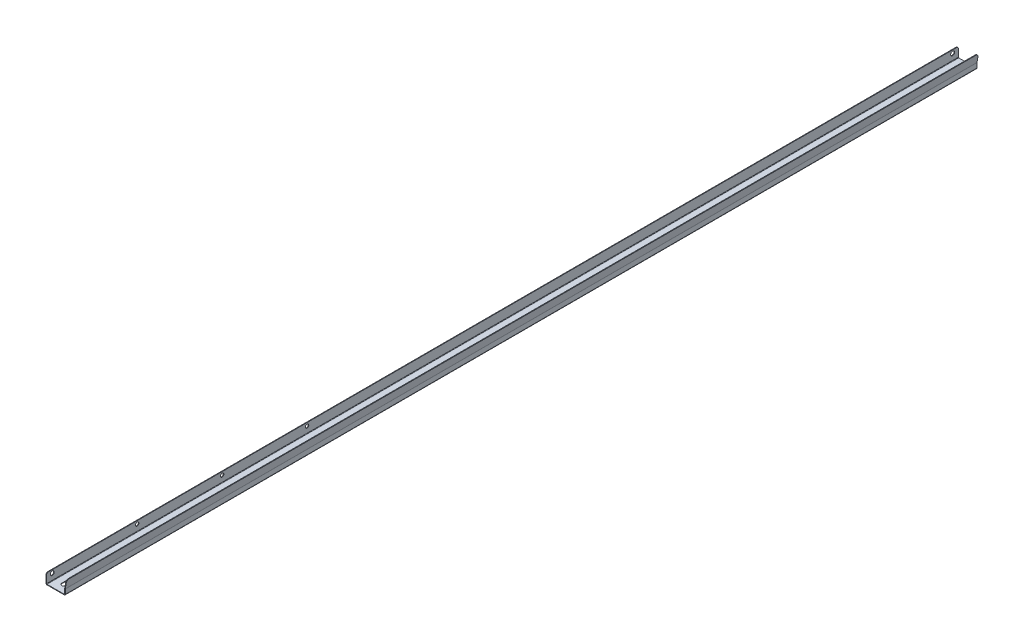
ISO-10303-21;
HEADER;
FILE_DESCRIPTION(('STEP AP214'),'2;1');
FILE_NAME('part.step','',(''),(''),'','','');
FILE_SCHEMA(('AUTOMOTIVE_DESIGN { 1 0 10303 214 1 1 1 1 }'));
ENDSEC;
DATA;
#1=APPLICATION_CONTEXT('core data for automotive mechanical design processes');
#2=APPLICATION_PROTOCOL_DEFINITION('international standard','automotive_design',2000,#1);
#3=PRODUCT_CONTEXT('',#1,'mechanical');
#4=PRODUCT('Part','Part','',(#3));
#5=PRODUCT_RELATED_PRODUCT_CATEGORY('part','',(#4));
#6=PRODUCT_DEFINITION_FORMATION('','',#4);
#7=PRODUCT_DEFINITION_CONTEXT('part definition',#1,'design');
#8=PRODUCT_DEFINITION('design','',#6,#7);
#9=PRODUCT_DEFINITION_SHAPE('','',#8);
#10=(LENGTH_UNIT() NAMED_UNIT(*) SI_UNIT(.MILLI.,.METRE.));
#11=(NAMED_UNIT(*) PLANE_ANGLE_UNIT() SI_UNIT($,.RADIAN.));
#12=(NAMED_UNIT(*) SI_UNIT($,.STERADIAN.) SOLID_ANGLE_UNIT());
#13=UNCERTAINTY_MEASURE_WITH_UNIT(LENGTH_MEASURE(1.E-05),#10,'distance_accuracy_value','');
#14=(GEOMETRIC_REPRESENTATION_CONTEXT(3) GLOBAL_UNCERTAINTY_ASSIGNED_CONTEXT((#13)) GLOBAL_UNIT_ASSIGNED_CONTEXT((#10,
#11,#12)) REPRESENTATION_CONTEXT('',''));
#15=CARTESIAN_POINT('',(0.,0.,0.));
#16=DIRECTION('',(0.,0.,1.));
#17=DIRECTION('',(1.,0.,0.));
#18=AXIS2_PLACEMENT_3D('',#15,#16,#17);
#19=CARTESIAN_POINT('',(3.99999999999992,9.,740.));
#20=DIRECTION('',(1.,0.,0.));
#21=DIRECTION('',(0.,0.,1.));
#22=AXIS2_PLACEMENT_3D('',#19,#20,#21);
#23=PLANE('',#22);
#24=DIRECTION('',(0.,0.,-1.));
#25=VECTOR('',#24,1.);
#26=CARTESIAN_POINT('',(4.00000000000006,0.,0.));
#27=LINE('',#26,#25);
#28=CARTESIAN_POINT('',(3.99999999999991,0.,790.));
#29=VERTEX_POINT('',#28);
#30=CARTESIAN_POINT('',(3.99999999999992,0.,740.));
#31=VERTEX_POINT('',#30);
#32=EDGE_CURVE('E413',#29,#31,#27,.T.);
#33=ORIENTED_EDGE('',*,*,#32,.T.);
#34=DIRECTION('',(0.,-1.,0.));
#35=VECTOR('',#34,1.);
#36=CARTESIAN_POINT('',(3.99999999999992,9.,740.));
#37=LINE('',#36,#35);
#38=CARTESIAN_POINT('',(3.99999999999992,-1.,740.));
#39=VERTEX_POINT('',#38);
#40=EDGE_CURVE('E594',#31,#39,#37,.T.);
#41=ORIENTED_EDGE('',*,*,#40,.T.);
#42=DIRECTION('',(0.,0.,1.));
#43=VECTOR('',#42,1.);
#44=CARTESIAN_POINT('',(3.99999999999992,-1.,740.));
#45=LINE('',#44,#43);
#46=CARTESIAN_POINT('',(4.,-1.,790.));
#47=VERTEX_POINT('',#46);
#48=EDGE_CURVE('E326',#39,#47,#45,.T.);
#49=ORIENTED_EDGE('',*,*,#48,.T.);
#50=DIRECTION('',(0.,-1.,0.));
#51=VECTOR('',#50,1.);
#52=CARTESIAN_POINT('',(4.,9.,790.));
#53=LINE('',#52,#51);
#54=EDGE_CURVE('E11',#29,#47,#53,.T.);
#55=ORIENTED_EDGE('',*,*,#54,.F.);
#56=EDGE_LOOP('',(#33,#41,#49,#55));
#57=FACE_BOUND('',#56,.T.);
#58=ADVANCED_FACE('F17',(#57),#23,.F.);
#59=CARTESIAN_POINT('',(0.,9.,790.));
#60=DIRECTION('',(0.,-1.,0.));
#61=DIRECTION('',(0.,0.,-1.));
#62=AXIS2_PLACEMENT_3D('',#59,#60,#61);
#63=CYLINDRICAL_SURFACE('',#62,4.);
#64=CARTESIAN_POINT('',(0.,0.,790.));
#65=DIRECTION('',(0.,1.,0.));
#66=DIRECTION('',(0.,0.,1.));
#67=AXIS2_PLACEMENT_3D('',#64,#65,#66);
#68=CIRCLE('',#67,4.);
#69=CARTESIAN_POINT('',(-4.00000000000009,0.,790.));
#70=VERTEX_POINT('',#69);
#71=EDGE_CURVE('E420',#70,#29,#68,.T.);
#72=ORIENTED_EDGE('',*,*,#71,.T.);
#73=ORIENTED_EDGE('',*,*,#54,.T.);
#74=CARTESIAN_POINT('',(0.,-1.,790.));
#75=DIRECTION('',(0.,-1.,0.));
#76=DIRECTION('',(0.,0.,-1.));
#77=AXIS2_PLACEMENT_3D('',#74,#75,#76);
#78=CIRCLE('',#77,4.);
#79=CARTESIAN_POINT('',(-4.00000000000009,-1.,790.));
#80=VERTEX_POINT('',#79);
#81=EDGE_CURVE('E361',#47,#80,#78,.T.);
#82=ORIENTED_EDGE('',*,*,#81,.T.);
#83=DIRECTION('',(0.,-1.,0.));
#84=VECTOR('',#83,1.);
#85=CARTESIAN_POINT('',(-4.00000000000009,9.,790.));
#86=LINE('',#85,#84);
#87=EDGE_CURVE('E21',#70,#80,#86,.T.);
#88=ORIENTED_EDGE('',*,*,#87,.F.);
#89=EDGE_LOOP('',(#72,#73,#82,#88));
#90=FACE_BOUND('',#89,.T.);
#91=ADVANCED_FACE('F19',(#90),#63,.F.);
#92=CARTESIAN_POINT('',(-4.00000000000008,9.,740.));
#93=DIRECTION('',(-1.,0.,0.));
#94=DIRECTION('',(0.,0.,1.));
#95=AXIS2_PLACEMENT_3D('',#92,#93,#94);
#96=PLANE('',#95);
#97=DIRECTION('',(0.,0.,1.));
#98=VECTOR('',#97,1.);
#99=CARTESIAN_POINT('',(-3.99999999999994,0.,0.));
#100=LINE('',#99,#98);
#101=CARTESIAN_POINT('',(-4.00000000000008,0.,740.));
#102=VERTEX_POINT('',#101);
#103=EDGE_CURVE('E424',#102,#70,#100,.T.);
#104=ORIENTED_EDGE('',*,*,#103,.T.);
#105=ORIENTED_EDGE('',*,*,#87,.T.);
#106=DIRECTION('',(0.,0.,-1.));
#107=VECTOR('',#106,1.);
#108=CARTESIAN_POINT('',(-4.00000000000008,-1.,740.));
#109=LINE('',#108,#107);
#110=CARTESIAN_POINT('',(-4.00000000000008,-1.,740.));
#111=VERTEX_POINT('',#110);
#112=EDGE_CURVE('E380',#80,#111,#109,.T.);
#113=ORIENTED_EDGE('',*,*,#112,.T.);
#114=DIRECTION('',(0.,-1.,0.));
#115=VECTOR('',#114,1.);
#116=CARTESIAN_POINT('',(-4.00000000000008,9.,740.));
#117=LINE('',#116,#115);
#118=EDGE_CURVE('E391',#102,#111,#117,.T.);
#119=ORIENTED_EDGE('',*,*,#118,.F.);
#120=EDGE_LOOP('',(#104,#105,#113,#119));
#121=FACE_BOUND('',#120,.T.);
#122=ADVANCED_FACE('F605',(#121),#96,.F.);
#123=CARTESIAN_POINT('',(0.,9.,740.));
#124=DIRECTION('',(0.,-1.,0.));
#125=DIRECTION('',(0.,0.,-1.));
#126=AXIS2_PLACEMENT_3D('',#123,#124,#125);
#127=CYLINDRICAL_SURFACE('',#126,4.);
#128=CARTESIAN_POINT('',(0.,0.,740.));
#129=DIRECTION('',(0.,1.,0.));
#130=DIRECTION('',(0.,0.,1.));
#131=AXIS2_PLACEMENT_3D('',#128,#129,#130);
#132=CIRCLE('',#131,4.);
#133=EDGE_CURVE('E404',#31,#102,#132,.T.);
#134=ORIENTED_EDGE('',*,*,#133,.T.);
#135=ORIENTED_EDGE('',*,*,#118,.T.);
#136=CARTESIAN_POINT('',(0.,-1.,740.));
#137=DIRECTION('',(0.,-1.,0.));
#138=DIRECTION('',(0.,0.,-1.));
#139=AXIS2_PLACEMENT_3D('',#136,#137,#138);
#140=CIRCLE('',#139,4.);
#141=EDGE_CURVE('E376',#111,#39,#140,.T.);
#142=ORIENTED_EDGE('',*,*,#141,.T.);
#143=ORIENTED_EDGE('',*,*,#40,.F.);
#144=EDGE_LOOP('',(#134,#135,#142,#143));
#145=FACE_BOUND('',#144,.T.);
#146=ADVANCED_FACE('F774',(#145),#127,.F.);
#147=CARTESIAN_POINT('',(17.7364817766693,18.935566193648,-800.));
#148=DIRECTION('',(0.984807753012209,-0.173648177666927,0.));
#149=DIRECTION('',(0.173648177666927,0.984807753012209,0.));
#150=AXIS2_PLACEMENT_3D('',#147,#148,#149);
#151=CYLINDRICAL_SURFACE('',#150,5.);
#152=CARTESIAN_POINT('',(17.7364817766693,18.935566193648,-800.));
#153=DIRECTION('',(-0.984807753012209,0.173648177666927,0.));
#154=DIRECTION('',(0.173648177666927,0.984807753012209,0.));
#155=AXIS2_PLACEMENT_3D('',#152,#153,#154);
#156=CIRCLE('',#155,5.);
#157=CARTESIAN_POINT('',(18.6047226650039,23.8596049587091,-800.));
#158=VERTEX_POINT('',#157);
#159=CARTESIAN_POINT('',(17.7364817766693,18.935566193648,-805.));
#160=VERTEX_POINT('',#159);
#161=EDGE_CURVE('E346',#158,#160,#156,.T.);
#162=ORIENTED_EDGE('',*,*,#161,.F.);
#163=DIRECTION('',(-0.984807753012209,0.173648177666927,0.));
#164=VECTOR('',#163,1.);
#165=CARTESIAN_POINT('',(18.6047226650039,23.8596049587091,-800.));
#166=LINE('',#165,#164);
#167=CARTESIAN_POINT('',(19.5895304180161,23.6859567810421,-800.));
#168=VERTEX_POINT('',#167);
#169=EDGE_CURVE('E40',#168,#158,#166,.T.);
#170=ORIENTED_EDGE('',*,*,#169,.F.);
#171=CARTESIAN_POINT('',(18.7212895296815,18.7619180159811,-800.));
#172=DIRECTION('',(0.984807753012209,-0.173648177666927,0.));
#173=DIRECTION('',(0.173648177666927,0.984807753012209,0.));
#174=AXIS2_PLACEMENT_3D('',#171,#172,#173);
#175=CIRCLE('',#174,5.);
#176=CARTESIAN_POINT('',(18.7212895296815,18.7619180159811,-805.));
#177=VERTEX_POINT('',#176);
#178=EDGE_CURVE('E229',#177,#168,#175,.T.);
#179=ORIENTED_EDGE('',*,*,#178,.F.);
#180=DIRECTION('',(0.984807753012209,-0.173648177666927,0.));
#181=VECTOR('',#180,1.);
#182=CARTESIAN_POINT('',(17.7364817766693,18.935566193648,-805.));
#183=LINE('',#182,#181);
#184=EDGE_CURVE('E408',#160,#177,#183,.T.);
#185=ORIENTED_EDGE('',*,*,#184,.F.);
#186=EDGE_LOOP('',(#162,#170,#179,#185));
#187=FACE_BOUND('',#186,.T.);
#188=ADVANCED_FACE('F770',(#187),#151,.T.);
#189=CARTESIAN_POINT('',(17.7364817766693,18.935566193648,800.));
#190=DIRECTION('',(0.984807753012209,-0.173648177666927,0.));
#191=DIRECTION('',(0.173648177666927,0.984807753012209,0.));
#192=AXIS2_PLACEMENT_3D('',#189,#190,#191);
#193=CYLINDRICAL_SURFACE('',#192,5.);
#194=CARTESIAN_POINT('',(17.7364817766693,18.935566193648,800.));
#195=DIRECTION('',(-0.984807753012209,0.173648177666927,0.));
#196=DIRECTION('',(0.173648177666927,0.984807753012209,0.));
#197=AXIS2_PLACEMENT_3D('',#194,#195,#196);
#198=CIRCLE('',#197,5.);
#199=CARTESIAN_POINT('',(17.7364817766693,18.9355661936481,805.));
#200=VERTEX_POINT('',#199);
#201=CARTESIAN_POINT('',(18.6047226650039,23.8596049587091,800.));
#202=VERTEX_POINT('',#201);
#203=EDGE_CURVE('E517',#200,#202,#198,.T.);
#204=ORIENTED_EDGE('',*,*,#203,.F.);
#205=DIRECTION('',(-0.984807753012209,0.173648177666927,0.));
#206=VECTOR('',#205,1.);
#207=CARTESIAN_POINT('',(17.7364817766693,18.9355661936481,805.));
#208=LINE('',#207,#206);
#209=CARTESIAN_POINT('',(18.7212895296815,18.7619180159811,805.));
#210=VERTEX_POINT('',#209);
#211=EDGE_CURVE('E548',#210,#200,#208,.T.);
#212=ORIENTED_EDGE('',*,*,#211,.F.);
#213=CARTESIAN_POINT('',(18.7212895296815,18.7619180159811,800.));
#214=DIRECTION('',(0.984807753012209,-0.173648177666927,0.));
#215=DIRECTION('',(0.173648177666927,0.984807753012209,0.));
#216=AXIS2_PLACEMENT_3D('',#213,#214,#215);
#217=CIRCLE('',#216,5.);
#218=CARTESIAN_POINT('',(19.5895304180161,23.6859567810421,800.));
#219=VERTEX_POINT('',#218);
#220=EDGE_CURVE('E345',#219,#210,#217,.T.);
#221=ORIENTED_EDGE('',*,*,#220,.F.);
#222=DIRECTION('',(0.984807753012209,-0.173648177666927,0.));
#223=VECTOR('',#222,1.);
#224=CARTESIAN_POINT('',(18.6047226650039,23.8596049587091,800.));
#225=LINE('',#224,#223);
#226=EDGE_CURVE('E54',#202,#219,#225,.T.);
#227=ORIENTED_EDGE('',*,*,#226,.F.);
#228=EDGE_LOOP('',(#204,#212,#221,#227));
#229=FACE_BOUND('',#228,.T.);
#230=ADVANCED_FACE('F773',(#229),#193,.T.);
#231=CARTESIAN_POINT('',(-17.,14.,-802.));
#232=DIRECTION('',(1.,0.,0.));
#233=DIRECTION('',(0.,1.,0.));
#234=AXIS2_PLACEMENT_3D('',#231,#232,#233);
#235=CYLINDRICAL_SURFACE('',#234,3.);
#236=CARTESIAN_POINT('',(-17.,14.,-802.));
#237=DIRECTION('',(-1.,0.,0.));
#238=DIRECTION('',(0.,1.,0.));
#239=AXIS2_PLACEMENT_3D('',#236,#237,#238);
#240=CIRCLE('',#239,3.);
#241=CARTESIAN_POINT('',(-17.,17.,-802.));
#242=VERTEX_POINT('',#241);
#243=CARTESIAN_POINT('',(-17.,14.,-805.));
#244=VERTEX_POINT('',#243);
#245=EDGE_CURVE('E352',#242,#244,#240,.T.);
#246=ORIENTED_EDGE('',*,*,#245,.F.);
#247=DIRECTION('',(-1.,0.,0.));
#248=VECTOR('',#247,1.);
#249=CARTESIAN_POINT('',(-17.,17.,-802.));
#250=LINE('',#249,#248);
#251=CARTESIAN_POINT('',(-16.,17.,-802.));
#252=VERTEX_POINT('',#251);
#253=EDGE_CURVE('E557',#252,#242,#250,.T.);
#254=ORIENTED_EDGE('',*,*,#253,.F.);
#255=CARTESIAN_POINT('',(-16.,14.,-802.));
#256=DIRECTION('',(1.,0.,0.));
#257=DIRECTION('',(0.,1.,0.));
#258=AXIS2_PLACEMENT_3D('',#255,#256,#257);
#259=CIRCLE('',#258,3.);
#260=CARTESIAN_POINT('',(-16.,14.,-805.));
#261=VERTEX_POINT('',#260);
#262=EDGE_CURVE('E533',#261,#252,#259,.T.);
#263=ORIENTED_EDGE('',*,*,#262,.F.);
#264=DIRECTION('',(1.,0.,0.));
#265=VECTOR('',#264,1.);
#266=CARTESIAN_POINT('',(-17.,14.,-805.));
#267=LINE('',#266,#265);
#268=EDGE_CURVE('E500',#244,#261,#267,.T.);
#269=ORIENTED_EDGE('',*,*,#268,.F.);
#270=EDGE_LOOP('',(#246,#254,#263,#269));
#271=FACE_BOUND('',#270,.T.);
#272=ADVANCED_FACE('F673',(#271),#235,.T.);
#273=CARTESIAN_POINT('',(-17.,14.,802.));
#274=DIRECTION('',(1.,0.,0.));
#275=DIRECTION('',(0.,1.,0.));
#276=AXIS2_PLACEMENT_3D('',#273,#274,#275);
#277=CYLINDRICAL_SURFACE('',#276,3.);
#278=CARTESIAN_POINT('',(-17.,14.,802.));
#279=DIRECTION('',(-1.,0.,0.));
#280=DIRECTION('',(0.,1.,0.));
#281=AXIS2_PLACEMENT_3D('',#278,#279,#280);
#282=CIRCLE('',#281,3.);
#283=CARTESIAN_POINT('',(-17.,14.,805.));
#284=VERTEX_POINT('',#283);
#285=CARTESIAN_POINT('',(-17.,17.,802.));
#286=VERTEX_POINT('',#285);
#287=EDGE_CURVE('E428',#284,#286,#282,.T.);
#288=ORIENTED_EDGE('',*,*,#287,.F.);
#289=DIRECTION('',(-1.,0.,0.));
#290=VECTOR('',#289,1.);
#291=CARTESIAN_POINT('',(-17.,14.,805.));
#292=LINE('',#291,#290);
#293=CARTESIAN_POINT('',(-16.,14.,805.));
#294=VERTEX_POINT('',#293);
#295=EDGE_CURVE('E368',#294,#284,#292,.T.);
#296=ORIENTED_EDGE('',*,*,#295,.F.);
#297=CARTESIAN_POINT('',(-16.,14.,802.));
#298=DIRECTION('',(1.,0.,0.));
#299=DIRECTION('',(0.,1.,0.));
#300=AXIS2_PLACEMENT_3D('',#297,#298,#299);
#301=CIRCLE('',#300,3.);
#302=CARTESIAN_POINT('',(-16.,17.,802.));
#303=VERTEX_POINT('',#302);
#304=EDGE_CURVE('E530',#303,#294,#301,.T.);
#305=ORIENTED_EDGE('',*,*,#304,.F.);
#306=DIRECTION('',(1.,0.,0.));
#307=VECTOR('',#306,1.);
#308=CARTESIAN_POINT('',(-17.,17.,802.));
#309=LINE('',#308,#307);
#310=EDGE_CURVE('E551',#286,#303,#309,.T.);
#311=ORIENTED_EDGE('',*,*,#310,.F.);
#312=EDGE_LOOP('',(#288,#296,#305,#311));
#313=FACE_BOUND('',#312,.T.);
#314=ADVANCED_FACE('F664',(#313),#277,.T.);
#315=CARTESIAN_POINT('',(-7.,11.5,-795.));
#316=DIRECTION('',(-1.,0.,0.));
#317=DIRECTION('',(0.,-1.,0.));
#318=AXIS2_PLACEMENT_3D('',#315,#316,#317);
#319=CYLINDRICAL_SURFACE('',#318,3.49999999999996);
#320=CARTESIAN_POINT('',(-16.,11.5,-795.));
#321=DIRECTION('',(1.,0.,0.));
#322=DIRECTION('',(0.,1.,0.));
#323=AXIS2_PLACEMENT_3D('',#320,#321,#322);
#324=CIRCLE('',#323,3.49999999999996);
#325=CARTESIAN_POINT('',(-16.,15.,-795.));
#326=VERTEX_POINT('',#325);
#327=EDGE_CURVE('E537',#326,#326,#324,.T.);
#328=ORIENTED_EDGE('',*,*,#327,.T.);
#329=EDGE_LOOP('',(#328));
#330=FACE_BOUND('',#329,.T.);
#331=CARTESIAN_POINT('',(-17.,11.5,-795.));
#332=DIRECTION('',(-1.,0.,0.));
#333=DIRECTION('',(0.,-1.,0.));
#334=AXIS2_PLACEMENT_3D('',#331,#332,#333);
#335=CIRCLE('',#334,3.49999999999996);
#336=CARTESIAN_POINT('',(-17.,8.,-795.));
#337=VERTEX_POINT('',#336);
#338=EDGE_CURVE('E355',#337,#337,#335,.T.);
#339=ORIENTED_EDGE('',*,*,#338,.T.);
#340=EDGE_LOOP('',(#339));
#341=FACE_BOUND('',#340,.T.);
#342=ADVANCED_FACE('F702',(#330,#341),#319,.F.);
#343=CARTESIAN_POINT('',(-7.,11.5,795.));
#344=DIRECTION('',(-1.,0.,0.));
#345=DIRECTION('',(0.,-1.,0.));
#346=AXIS2_PLACEMENT_3D('',#343,#344,#345);
#347=CYLINDRICAL_SURFACE('',#346,3.49999999999996);
#348=CARTESIAN_POINT('',(-16.,11.5,795.));
#349=DIRECTION('',(1.,0.,0.));
#350=DIRECTION('',(0.,1.,0.));
#351=AXIS2_PLACEMENT_3D('',#348,#349,#350);
#352=CIRCLE('',#351,3.49999999999996);
#353=CARTESIAN_POINT('',(-16.,15.,795.));
#354=VERTEX_POINT('',#353);
#355=EDGE_CURVE('E540',#354,#354,#352,.T.);
#356=ORIENTED_EDGE('',*,*,#355,.T.);
#357=EDGE_LOOP('',(#356));
#358=FACE_BOUND('',#357,.T.);
#359=CARTESIAN_POINT('',(-17.,11.5,795.));
#360=DIRECTION('',(-1.,0.,0.));
#361=DIRECTION('',(0.,-1.,0.));
#362=AXIS2_PLACEMENT_3D('',#359,#360,#361);
#363=CIRCLE('',#362,3.49999999999996);
#364=CARTESIAN_POINT('',(-17.,8.,795.));
#365=VERTEX_POINT('',#364);
#366=EDGE_CURVE('E521',#365,#365,#363,.T.);
#367=ORIENTED_EDGE('',*,*,#366,.T.);
#368=EDGE_LOOP('',(#367));
#369=FACE_BOUND('',#368,.T.);
#370=ADVANCED_FACE('F704',(#358,#369),#347,.F.);
#371=CARTESIAN_POINT('',(-7.,11.5,645.));
#372=DIRECTION('',(-1.,0.,0.));
#373=DIRECTION('',(0.,-1.,0.));
#374=AXIS2_PLACEMENT_3D('',#371,#372,#373);
#375=CYLINDRICAL_SURFACE('',#374,3.00000000000005);
#376=CARTESIAN_POINT('',(-16.,11.5,645.));
#377=DIRECTION('',(1.,0.,0.));
#378=DIRECTION('',(0.,1.,0.));
#379=AXIS2_PLACEMENT_3D('',#376,#377,#378);
#380=CIRCLE('',#379,3.00000000000005);
#381=CARTESIAN_POINT('',(-16.,14.5,645.));
#382=VERTEX_POINT('',#381);
#383=EDGE_CURVE('E385',#382,#382,#380,.T.);
#384=ORIENTED_EDGE('',*,*,#383,.T.);
#385=EDGE_LOOP('',(#384));
#386=FACE_BOUND('',#385,.T.);
#387=CARTESIAN_POINT('',(-17.,11.5,645.));
#388=DIRECTION('',(-1.,0.,0.));
#389=DIRECTION('',(0.,-1.,0.));
#390=AXIS2_PLACEMENT_3D('',#387,#388,#389);
#391=CIRCLE('',#390,3.00000000000005);
#392=CARTESIAN_POINT('',(-17.,8.49999999999986,645.));
#393=VERTEX_POINT('',#392);
#394=EDGE_CURVE('E437',#393,#393,#391,.T.);
#395=ORIENTED_EDGE('',*,*,#394,.T.);
#396=EDGE_LOOP('',(#395));
#397=FACE_BOUND('',#396,.T.);
#398=ADVANCED_FACE('F643',(#386,#397),#375,.F.);
#399=CARTESIAN_POINT('',(-7.,11.5,495.));
#400=DIRECTION('',(-1.,0.,0.));
#401=DIRECTION('',(0.,-1.,0.));
#402=AXIS2_PLACEMENT_3D('',#399,#400,#401);
#403=CYLINDRICAL_SURFACE('',#402,3.00000000000005);
#404=CARTESIAN_POINT('',(-16.,11.5,495.));
#405=DIRECTION('',(1.,0.,0.));
#406=DIRECTION('',(0.,1.,0.));
#407=AXIS2_PLACEMENT_3D('',#404,#405,#406);
#408=CIRCLE('',#407,3.00000000000005);
#409=CARTESIAN_POINT('',(-16.,14.5,495.));
#410=VERTEX_POINT('',#409);
#411=EDGE_CURVE('E381',#410,#410,#408,.T.);
#412=ORIENTED_EDGE('',*,*,#411,.T.);
#413=EDGE_LOOP('',(#412));
#414=FACE_BOUND('',#413,.T.);
#415=CARTESIAN_POINT('',(-17.,11.5,495.));
#416=DIRECTION('',(-1.,0.,0.));
#417=DIRECTION('',(0.,-1.,0.));
#418=AXIS2_PLACEMENT_3D('',#415,#416,#417);
#419=CIRCLE('',#418,3.00000000000005);
#420=CARTESIAN_POINT('',(-17.,8.49999999999983,495.));
#421=VERTEX_POINT('',#420);
#422=EDGE_CURVE('E433',#421,#421,#419,.T.);
#423=ORIENTED_EDGE('',*,*,#422,.T.);
#424=EDGE_LOOP('',(#423));
#425=FACE_BOUND('',#424,.T.);
#426=ADVANCED_FACE('F777',(#414,#425),#403,.F.);
#427=CARTESIAN_POINT('',(-7.,11.5,345.));
#428=DIRECTION('',(-1.,0.,0.));
#429=DIRECTION('',(0.,-1.,0.));
#430=AXIS2_PLACEMENT_3D('',#427,#428,#429);
#431=CYLINDRICAL_SURFACE('',#430,3.);
#432=CARTESIAN_POINT('',(-16.,11.4999999999999,345.));
#433=DIRECTION('',(1.,0.,0.));
#434=DIRECTION('',(0.,1.,0.));
#435=AXIS2_PLACEMENT_3D('',#432,#433,#434);
#436=CIRCLE('',#435,3.);
#437=CARTESIAN_POINT('',(-16.,14.4999999999999,345.));
#438=VERTEX_POINT('',#437);
#439=EDGE_CURVE('E384',#438,#438,#436,.T.);
#440=ORIENTED_EDGE('',*,*,#439,.T.);
#441=EDGE_LOOP('',(#440));
#442=FACE_BOUND('',#441,.T.);
#443=CARTESIAN_POINT('',(-17.,11.4999999999999,345.));
#444=DIRECTION('',(-1.,0.,0.));
#445=DIRECTION('',(0.,-1.,0.));
#446=AXIS2_PLACEMENT_3D('',#443,#444,#445);
#447=CIRCLE('',#446,3.);
#448=CARTESIAN_POINT('',(-17.,8.49999999999987,345.));
#449=VERTEX_POINT('',#448);
#450=EDGE_CURVE('E436',#449,#449,#447,.T.);
#451=ORIENTED_EDGE('',*,*,#450,.T.);
#452=EDGE_LOOP('',(#451));
#453=FACE_BOUND('',#452,.T.);
#454=ADVANCED_FACE('F769',(#442,#453),#431,.F.);
#455=CARTESIAN_POINT('',(18.6047226650039,23.8596049587091,-805.));
#456=DIRECTION('',(-0.173648177666927,-0.984807753012209,0.));
#457=DIRECTION('',(-0.984807753012209,0.173648177666927,0.));
#458=AXIS2_PLACEMENT_3D('',#455,#456,#457);
#459=PLANE('',#458);
#460=DIRECTION('',(0.,0.,-1.));
#461=VECTOR('',#460,1.);
#462=CARTESIAN_POINT('',(18.6047226650039,23.8596049587091,-805.));
#463=LINE('',#462,#461);
#464=EDGE_CURVE('E416',#202,#158,#463,.T.);
#465=ORIENTED_EDGE('',*,*,#464,.F.);
#466=ORIENTED_EDGE('',*,*,#226,.T.);
#467=DIRECTION('',(0.,0.,-1.));
#468=VECTOR('',#467,1.);
#469=CARTESIAN_POINT('',(19.5895304180161,23.6859567810421,-805.));
#470=LINE('',#469,#468);
#471=EDGE_CURVE('E343',#219,#168,#470,.T.);
#472=ORIENTED_EDGE('',*,*,#471,.T.);
#473=ORIENTED_EDGE('',*,*,#169,.T.);
#474=EDGE_LOOP('',(#465,#466,#472,#473));
#475=FACE_BOUND('',#474,.T.);
#476=ADVANCED_FACE('F765',(#475),#459,.F.);
#477=CARTESIAN_POINT('',(14.9482966317148,-2.63578801180474,0.));
#478=DIRECTION('',(0.984807753012209,-0.173648177666927,0.));
#479=DIRECTION('',(0.,0.,-1.));
#480=AXIS2_PLACEMENT_3D('',#477,#478,#479);
#481=PLANE('',#480);
#482=ORIENTED_EDGE('',*,*,#471,.F.);
#483=ORIENTED_EDGE('',*,*,#220,.T.);
#484=DIRECTION('',(0.173648177666927,0.984807753012209,0.));
#485=VECTOR('',#484,1.);
#486=CARTESIAN_POINT('',(19.5895304180161,23.6859567810421,805.));
#487=LINE('',#486,#485);
#488=CARTESIAN_POINT('',(17.0111906091313,9.06346509811626,805.));
#489=VERTEX_POINT('',#488);
#490=EDGE_CURVE('E474',#489,#210,#487,.T.);
#491=ORIENTED_EDGE('',*,*,#490,.F.);
#492=DIRECTION('',(0.,0.,1.));
#493=VECTOR('',#492,1.);
#494=CARTESIAN_POINT('',(17.0111906091313,9.06346509811626,-805.));
#495=LINE('',#494,#493);
#496=CARTESIAN_POINT('',(17.0111906091313,9.06346509811626,-805.));
#497=VERTEX_POINT('',#496);
#498=EDGE_CURVE('E470',#497,#489,#495,.T.);
#499=ORIENTED_EDGE('',*,*,#498,.F.);
#500=DIRECTION('',(-0.173648177666927,-0.984807753012209,0.));
#501=VECTOR('',#500,1.);
#502=CARTESIAN_POINT('',(17.,9.,-805.));
#503=LINE('',#502,#501);
#504=EDGE_CURVE('E580',#177,#497,#503,.T.);
#505=ORIENTED_EDGE('',*,*,#504,.F.);
#506=ORIENTED_EDGE('',*,*,#178,.T.);
#507=EDGE_LOOP('',(#482,#483,#491,#499,#505,#506));
#508=FACE_BOUND('',#507,.T.);
#509=ADVANCED_FACE('F768',(#508),#481,.T.);
#510=CARTESIAN_POINT('',(13.9634888787026,-2.46213983413781,0.));
#511=DIRECTION('',(0.984807753012209,-0.173648177666927,0.));
#512=DIRECTION('',(0.,0.,-1.));
#513=AXIS2_PLACEMENT_3D('',#510,#511,#512);
#514=PLANE('',#513);
#515=DIRECTION('',(0.173648177666927,0.984807753012209,0.));
#516=VECTOR('',#515,1.);
#517=CARTESIAN_POINT('',(18.6047226650039,23.8596049587091,805.));
#518=LINE('',#517,#516);
#519=CARTESIAN_POINT('',(16.026382856119,9.23711327578318,805.));
#520=VERTEX_POINT('',#519);
#521=EDGE_CURVE('E409',#520,#200,#518,.T.);
#522=ORIENTED_EDGE('',*,*,#521,.T.);
#523=ORIENTED_EDGE('',*,*,#203,.T.);
#524=ORIENTED_EDGE('',*,*,#464,.T.);
#525=ORIENTED_EDGE('',*,*,#161,.T.);
#526=DIRECTION('',(-0.173648177666927,-0.984807753012209,0.));
#527=VECTOR('',#526,1.);
#528=CARTESIAN_POINT('',(16.0151922469879,9.17364817766693,-805.));
#529=LINE('',#528,#527);
#530=CARTESIAN_POINT('',(16.026382856119,9.23711327578319,-805.));
#531=VERTEX_POINT('',#530);
#532=EDGE_CURVE('E405',#160,#531,#529,.T.);
#533=ORIENTED_EDGE('',*,*,#532,.T.);
#534=DIRECTION('',(0.,0.,-1.));
#535=VECTOR('',#534,1.);
#536=CARTESIAN_POINT('',(16.026382856119,9.23711327578319,0.));
#537=LINE('',#536,#535);
#538=EDGE_CURVE('E475',#520,#531,#537,.T.);
#539=ORIENTED_EDGE('',*,*,#538,.F.);
#540=EDGE_LOOP('',(#522,#523,#524,#525,#533,#539));
#541=FACE_BOUND('',#540,.T.);
#542=ADVANCED_FACE('F763',(#541),#514,.F.);
#543=CARTESIAN_POINT('',(16.0151922469879,9.17364817766693,-805.));
#544=DIRECTION('',(0.,0.,1.));
#545=DIRECTION('',(1.,0.,0.));
#546=AXIS2_PLACEMENT_3D('',#543,#544,#545);
#547=PLANE('',#546);
#548=ORIENTED_EDGE('',*,*,#532,.F.);
#549=ORIENTED_EDGE('',*,*,#184,.T.);
#550=ORIENTED_EDGE('',*,*,#504,.T.);
#551=DIRECTION('',(-0.984807753012209,0.173648177666927,0.));
#552=VECTOR('',#551,1.);
#553=CARTESIAN_POINT('',(17.0111906091313,9.06346509811626,-805.));
#554=LINE('',#553,#552);
#555=EDGE_CURVE('E284',#497,#531,#554,.T.);
#556=ORIENTED_EDGE('',*,*,#555,.T.);
#557=EDGE_LOOP('',(#548,#549,#550,#556));
#558=FACE_BOUND('',#557,.T.);
#559=ADVANCED_FACE('F759',(#558),#547,.F.);
#560=CARTESIAN_POINT('',(18.6047226650039,23.8596049587091,805.));
#561=DIRECTION('',(0.,0.,-1.));
#562=DIRECTION('',(0.,-1.,0.));
#563=AXIS2_PLACEMENT_3D('',#560,#561,#562);
#564=PLANE('',#563);
#565=ORIENTED_EDGE('',*,*,#490,.T.);
#566=ORIENTED_EDGE('',*,*,#211,.T.);
#567=ORIENTED_EDGE('',*,*,#521,.F.);
#568=DIRECTION('',(-0.984807753012209,0.173648177666927,0.));
#569=VECTOR('',#568,1.);
#570=CARTESIAN_POINT('',(17.0111906091313,9.06346509811625,805.));
#571=LINE('',#570,#569);
#572=EDGE_CURVE('E332',#489,#520,#571,.T.);
#573=ORIENTED_EDGE('',*,*,#572,.F.);
#574=EDGE_LOOP('',(#565,#566,#567,#573));
#575=FACE_BOUND('',#574,.T.);
#576=ADVANCED_FACE('F755',(#575),#564,.F.);
#577=CARTESIAN_POINT('',(17.7366,8.9355558504468,805.));
#578=DIRECTION('',(0.,0.,1.));
#579=DIRECTION('',(-0.984807753012209,0.173648177666928,0.));
#580=AXIS2_PLACEMENT_3D('',#577,#578,#579);
#581=CYLINDRICAL_SURFACE('',#580,0.73660000000001);
#582=DIRECTION('',(0.,0.,-1.));
#583=VECTOR('',#582,1.);
#584=CARTESIAN_POINT('',(17.,8.9355558504468,805.));
#585=LINE('',#584,#583);
#586=CARTESIAN_POINT('',(17.,8.9355558504468,805.));
#587=VERTEX_POINT('',#586);
#588=CARTESIAN_POINT('',(17.,8.9355558504468,-805.));
#589=VERTEX_POINT('',#588);
#590=EDGE_CURVE('E298',#587,#589,#585,.T.);
#591=ORIENTED_EDGE('',*,*,#590,.T.);
#592=CARTESIAN_POINT('',(17.7366,8.9355558504468,-805.));
#593=DIRECTION('',(0.,0.,-1.));
#594=DIRECTION('',(1.,0.,0.));
#595=AXIS2_PLACEMENT_3D('',#592,#593,#594);
#596=CIRCLE('',#595,0.736600000000011);
#597=EDGE_CURVE('E562',#589,#497,#596,.T.);
#598=ORIENTED_EDGE('',*,*,#597,.T.);
#599=ORIENTED_EDGE('',*,*,#498,.T.);
#600=CARTESIAN_POINT('',(17.7366,8.9355558504468,805.));
#601=DIRECTION('',(0.,0.,1.));
#602=DIRECTION('',(1.,0.,0.));
#603=AXIS2_PLACEMENT_3D('',#600,#601,#602);
#604=CIRCLE('',#603,0.736600000000011);
#605=EDGE_CURVE('E328',#489,#587,#604,.T.);
#606=ORIENTED_EDGE('',*,*,#605,.T.);
#607=EDGE_LOOP('',(#591,#598,#599,#606));
#608=FACE_BOUND('',#607,.T.);
#609=ADVANCED_FACE('F751',(#608),#581,.F.);
#610=CARTESIAN_POINT('',(17.7366,8.9355558504468,805.));
#611=DIRECTION('',(0.,0.,1.));
#612=DIRECTION('',(-0.984807753012209,0.173648177666927,0.));
#613=AXIS2_PLACEMENT_3D('',#610,#611,#612);
#614=CYLINDRICAL_SURFACE('',#613,1.7366);
#615=DIRECTION('',(0.,0.,-1.));
#616=VECTOR('',#615,1.);
#617=CARTESIAN_POINT('',(16.,8.93555585044681,805.));
#618=LINE('',#617,#616);
#619=CARTESIAN_POINT('',(16.,8.93555585044681,805.));
#620=VERTEX_POINT('',#619);
#621=CARTESIAN_POINT('',(16.,8.9355558504468,-805.));
#622=VERTEX_POINT('',#621);
#623=EDGE_CURVE('E297',#620,#622,#618,.T.);
#624=ORIENTED_EDGE('',*,*,#623,.F.);
#625=CARTESIAN_POINT('',(17.7366,8.9355558504468,805.));
#626=DIRECTION('',(0.,0.,1.));
#627=DIRECTION('',(1.,0.,0.));
#628=AXIS2_PLACEMENT_3D('',#625,#626,#627);
#629=CIRCLE('',#628,1.7366);
#630=EDGE_CURVE('E510',#520,#620,#629,.T.);
#631=ORIENTED_EDGE('',*,*,#630,.F.);
#632=ORIENTED_EDGE('',*,*,#538,.T.);
#633=CARTESIAN_POINT('',(17.7366,8.9355558504468,-805.));
#634=DIRECTION('',(0.,0.,-1.));
#635=DIRECTION('',(1.,0.,0.));
#636=AXIS2_PLACEMENT_3D('',#633,#634,#635);
#637=CIRCLE('',#636,1.7366);
#638=EDGE_CURVE('E333',#622,#531,#637,.T.);
#639=ORIENTED_EDGE('',*,*,#638,.F.);
#640=EDGE_LOOP('',(#624,#631,#632,#639));
#641=FACE_BOUND('',#640,.T.);
#642=ADVANCED_FACE('F747',(#641),#614,.T.);
#643=CARTESIAN_POINT('',(17.7366,8.9355558504468,805.));
#644=DIRECTION('',(0.,0.,-1.));
#645=DIRECTION('',(0.,-1.,0.));
#646=AXIS2_PLACEMENT_3D('',#643,#644,#645);
#647=PLANE('',#646);
#648=ORIENTED_EDGE('',*,*,#605,.F.);
#649=ORIENTED_EDGE('',*,*,#572,.T.);
#650=ORIENTED_EDGE('',*,*,#630,.T.);
#651=DIRECTION('',(-1.,0.,0.));
#652=VECTOR('',#651,1.);
#653=CARTESIAN_POINT('',(17.,8.9355558504468,805.));
#654=LINE('',#653,#652);
#655=EDGE_CURVE('E621',#587,#620,#654,.T.);
#656=ORIENTED_EDGE('',*,*,#655,.F.);
#657=EDGE_LOOP('',(#648,#649,#650,#656));
#658=FACE_BOUND('',#657,.T.);
#659=ADVANCED_FACE('F743',(#658),#647,.F.);
#660=CARTESIAN_POINT('',(17.7366,8.9355558504468,-805.));
#661=DIRECTION('',(0.,0.,-1.));
#662=DIRECTION('',(0.,-1.,0.));
#663=AXIS2_PLACEMENT_3D('',#660,#661,#662);
#664=PLANE('',#663);
#665=ORIENTED_EDGE('',*,*,#555,.F.);
#666=ORIENTED_EDGE('',*,*,#597,.F.);
#667=DIRECTION('',(-1.,0.,0.));
#668=VECTOR('',#667,1.);
#669=CARTESIAN_POINT('',(17.,8.9355558504468,-805.));
#670=LINE('',#669,#668);
#671=EDGE_CURVE('E310',#589,#622,#670,.T.);
#672=ORIENTED_EDGE('',*,*,#671,.T.);
#673=ORIENTED_EDGE('',*,*,#638,.T.);
#674=EDGE_LOOP('',(#665,#666,#672,#673));
#675=FACE_BOUND('',#674,.T.);
#676=ADVANCED_FACE('F739',(#675),#664,.T.);
#677=CARTESIAN_POINT('',(15.2634,0.7366,-805.));
#678=DIRECTION('',(0.,0.,-1.));
#679=DIRECTION('',(1.,0.,0.));
#680=AXIS2_PLACEMENT_3D('',#677,#678,#679);
#681=CYLINDRICAL_SURFACE('',#680,0.7366);
#682=DIRECTION('',(0.,0.,1.));
#683=VECTOR('',#682,1.);
#684=CARTESIAN_POINT('',(15.2634,0.,-805.));
#685=LINE('',#684,#683);
#686=CARTESIAN_POINT('',(15.2634,0.,-805.));
#687=VERTEX_POINT('',#686);
#688=CARTESIAN_POINT('',(15.2634,0.,805.));
#689=VERTEX_POINT('',#688);
#690=EDGE_CURVE('E320',#687,#689,#685,.T.);
#691=ORIENTED_EDGE('',*,*,#690,.T.);
#692=CARTESIAN_POINT('',(15.2634,0.7366,805.));
#693=DIRECTION('',(0.,0.,1.));
#694=DIRECTION('',(-1.,0.,0.));
#695=AXIS2_PLACEMENT_3D('',#692,#693,#694);
#696=CIRCLE('',#695,0.7366);
#697=CARTESIAN_POINT('',(16.,0.7366,805.));
#698=VERTEX_POINT('',#697);
#699=EDGE_CURVE('E395',#689,#698,#696,.T.);
#700=ORIENTED_EDGE('',*,*,#699,.T.);
#701=DIRECTION('',(0.,0.,-1.));
#702=VECTOR('',#701,1.);
#703=CARTESIAN_POINT('',(16.,0.7366,805.));
#704=LINE('',#703,#702);
#705=CARTESIAN_POINT('',(16.,0.7366,-805.));
#706=VERTEX_POINT('',#705);
#707=EDGE_CURVE('E351',#698,#706,#704,.T.);
#708=ORIENTED_EDGE('',*,*,#707,.T.);
#709=CARTESIAN_POINT('',(15.2634,0.7366,-805.));
#710=DIRECTION('',(0.,0.,-1.));
#711=DIRECTION('',(-1.,0.,0.));
#712=AXIS2_PLACEMENT_3D('',#709,#710,#711);
#713=CIRCLE('',#712,0.7366);
#714=EDGE_CURVE('E264',#706,#687,#713,.T.);
#715=ORIENTED_EDGE('',*,*,#714,.T.);
#716=EDGE_LOOP('',(#691,#700,#708,#715));
#717=FACE_BOUND('',#716,.T.);
#718=ADVANCED_FACE('F736',(#717),#681,.F.);
#719=CARTESIAN_POINT('',(15.2634,0.7366,-805.));
#720=DIRECTION('',(0.,0.,-1.));
#721=DIRECTION('',(1.,0.,0.));
#722=AXIS2_PLACEMENT_3D('',#719,#720,#721);
#723=CYLINDRICAL_SURFACE('',#722,1.7366);
#724=DIRECTION('',(0.,0.,1.));
#725=VECTOR('',#724,1.);
#726=CARTESIAN_POINT('',(15.2634,-1.,-805.));
#727=LINE('',#726,#725);
#728=CARTESIAN_POINT('',(15.2634,-1.,-805.));
#729=VERTEX_POINT('',#728);
#730=CARTESIAN_POINT('',(15.2634,-1.,805.));
#731=VERTEX_POINT('',#730);
#732=EDGE_CURVE('E281',#729,#731,#727,.T.);
#733=ORIENTED_EDGE('',*,*,#732,.F.);
#734=CARTESIAN_POINT('',(15.2634,0.7366,-805.));
#735=DIRECTION('',(0.,0.,-1.));
#736=DIRECTION('',(-1.,0.,0.));
#737=AXIS2_PLACEMENT_3D('',#734,#735,#736);
#738=CIRCLE('',#737,1.7366);
#739=CARTESIAN_POINT('',(17.,0.7366,-805.));
#740=VERTEX_POINT('',#739);
#741=EDGE_CURVE('E275',#740,#729,#738,.T.);
#742=ORIENTED_EDGE('',*,*,#741,.F.);
#743=DIRECTION('',(0.,0.,1.));
#744=VECTOR('',#743,1.);
#745=CARTESIAN_POINT('',(17.,0.7366,0.));
#746=LINE('',#745,#744);
#747=CARTESIAN_POINT('',(17.,0.7366,805.));
#748=VERTEX_POINT('',#747);
#749=EDGE_CURVE('E278',#740,#748,#746,.T.);
#750=ORIENTED_EDGE('',*,*,#749,.T.);
#751=CARTESIAN_POINT('',(15.2634,0.7366,805.));
#752=DIRECTION('',(0.,0.,1.));
#753=DIRECTION('',(-1.,0.,0.));
#754=AXIS2_PLACEMENT_3D('',#751,#752,#753);
#755=CIRCLE('',#754,1.7366);
#756=EDGE_CURVE('E392',#731,#748,#755,.T.);
#757=ORIENTED_EDGE('',*,*,#756,.F.);
#758=EDGE_LOOP('',(#733,#742,#750,#757));
#759=FACE_BOUND('',#758,.T.);
#760=ADVANCED_FACE('F277',(#759),#723,.T.);
#761=CARTESIAN_POINT('',(15.2634,0.7366,-805.));
#762=DIRECTION('',(0.,0.,1.));
#763=DIRECTION('',(1.,0.,0.));
#764=AXIS2_PLACEMENT_3D('',#761,#762,#763);
#765=PLANE('',#764);
#766=ORIENTED_EDGE('',*,*,#714,.F.);
#767=DIRECTION('',(1.,0.,0.));
#768=VECTOR('',#767,1.);
#769=CARTESIAN_POINT('',(16.,0.7366,-805.));
#770=LINE('',#769,#768);
#771=EDGE_CURVE('E301',#706,#740,#770,.T.);
#772=ORIENTED_EDGE('',*,*,#771,.T.);
#773=ORIENTED_EDGE('',*,*,#741,.T.);
#774=DIRECTION('',(0.,-1.,0.));
#775=VECTOR('',#774,1.);
#776=CARTESIAN_POINT('',(15.2634,0.,-805.));
#777=LINE('',#776,#775);
#778=EDGE_CURVE('E432',#687,#729,#777,.T.);
#779=ORIENTED_EDGE('',*,*,#778,.F.);
#780=EDGE_LOOP('',(#766,#772,#773,#779));
#781=FACE_BOUND('',#780,.T.);
#782=ADVANCED_FACE('F302',(#781),#765,.F.);
#783=CARTESIAN_POINT('',(15.2634,0.7366,805.));
#784=DIRECTION('',(0.,0.,1.));
#785=DIRECTION('',(1.,0.,0.));
#786=AXIS2_PLACEMENT_3D('',#783,#784,#785);
#787=PLANE('',#786);
#788=DIRECTION('',(1.,0.,0.));
#789=VECTOR('',#788,1.);
#790=CARTESIAN_POINT('',(16.,0.7366,805.));
#791=LINE('',#790,#789);
#792=EDGE_CURVE('E628',#698,#748,#791,.T.);
#793=ORIENTED_EDGE('',*,*,#792,.F.);
#794=ORIENTED_EDGE('',*,*,#699,.F.);
#795=DIRECTION('',(0.,-1.,0.));
#796=VECTOR('',#795,1.);
#797=CARTESIAN_POINT('',(15.2634,0.,805.));
#798=LINE('',#797,#796);
#799=EDGE_CURVE('E442',#689,#731,#798,.T.);
#800=ORIENTED_EDGE('',*,*,#799,.T.);
#801=ORIENTED_EDGE('',*,*,#756,.T.);
#802=EDGE_LOOP('',(#793,#794,#800,#801));
#803=FACE_BOUND('',#802,.T.);
#804=ADVANCED_FACE('F728',(#803),#787,.T.);
#805=CARTESIAN_POINT('',(-17.,17.,-805.));
#806=DIRECTION('',(0.,-1.,0.));
#807=DIRECTION('',(0.,0.,-1.));
#808=AXIS2_PLACEMENT_3D('',#805,#806,#807);
#809=PLANE('',#808);
#810=DIRECTION('',(0.,0.,-1.));
#811=VECTOR('',#810,1.);
#812=CARTESIAN_POINT('',(-17.,17.,-805.));
#813=LINE('',#812,#811);
#814=EDGE_CURVE('E356',#286,#242,#813,.T.);
#815=ORIENTED_EDGE('',*,*,#814,.F.);
#816=ORIENTED_EDGE('',*,*,#310,.T.);
#817=DIRECTION('',(0.,0.,-1.));
#818=VECTOR('',#817,1.);
#819=CARTESIAN_POINT('',(-16.,17.,-805.));
#820=LINE('',#819,#818);
#821=EDGE_CURVE('E526',#303,#252,#820,.T.);
#822=ORIENTED_EDGE('',*,*,#821,.T.);
#823=ORIENTED_EDGE('',*,*,#253,.T.);
#824=EDGE_LOOP('',(#815,#816,#822,#823));
#825=FACE_BOUND('',#824,.T.);
#826=ADVANCED_FACE('F668',(#825),#809,.F.);
#827=CARTESIAN_POINT('',(-16.,0.,0.));
#828=DIRECTION('',(1.,0.,0.));
#829=DIRECTION('',(0.,1.,0.));
#830=AXIS2_PLACEMENT_3D('',#827,#828,#829);
#831=PLANE('',#830);
#832=ORIENTED_EDGE('',*,*,#439,.F.);
#833=EDGE_LOOP('',(#832));
#834=FACE_BOUND('',#833,.T.);
#835=ORIENTED_EDGE('',*,*,#411,.F.);
#836=EDGE_LOOP('',(#835));
#837=FACE_BOUND('',#836,.T.);
#838=ORIENTED_EDGE('',*,*,#383,.F.);
#839=EDGE_LOOP('',(#838));
#840=FACE_BOUND('',#839,.T.);
#841=ORIENTED_EDGE('',*,*,#355,.F.);
#842=EDGE_LOOP('',(#841));
#843=FACE_BOUND('',#842,.T.);
#844=ORIENTED_EDGE('',*,*,#327,.F.);
#845=EDGE_LOOP('',(#844));
#846=FACE_BOUND('',#845,.T.);
#847=ORIENTED_EDGE('',*,*,#821,.F.);
#848=ORIENTED_EDGE('',*,*,#304,.T.);
#849=DIRECTION('',(0.,1.,0.));
#850=VECTOR('',#849,1.);
#851=CARTESIAN_POINT('',(-16.,17.,805.));
#852=LINE('',#851,#850);
#853=CARTESIAN_POINT('',(-16.,0.736599999999927,805.));
#854=VERTEX_POINT('',#853);
#855=EDGE_CURVE('E364',#854,#294,#852,.T.);
#856=ORIENTED_EDGE('',*,*,#855,.F.);
#857=DIRECTION('',(0.,0.,1.));
#858=VECTOR('',#857,1.);
#859=CARTESIAN_POINT('',(-16.,0.7366,-805.));
#860=LINE('',#859,#858);
#861=CARTESIAN_POINT('',(-16.,0.736600000000046,-805.));
#862=VERTEX_POINT('',#861);
#863=EDGE_CURVE('E369',#862,#854,#860,.T.);
#864=ORIENTED_EDGE('',*,*,#863,.F.);
#865=DIRECTION('',(0.,-1.,0.));
#866=VECTOR('',#865,1.);
#867=CARTESIAN_POINT('',(-16.,0.,-805.));
#868=LINE('',#867,#866);
#869=EDGE_CURVE('E504',#261,#862,#868,.T.);
#870=ORIENTED_EDGE('',*,*,#869,.F.);
#871=ORIENTED_EDGE('',*,*,#262,.T.);
#872=EDGE_LOOP('',(#847,#848,#856,#864,#870,#871));
#873=FACE_BOUND('',#872,.T.);
#874=ADVANCED_FACE('F649',(#834,#837,#840,#843,#846,#873),#831,.T.);
#875=CARTESIAN_POINT('',(-17.,0.,0.));
#876=DIRECTION('',(1.,0.,0.));
#877=DIRECTION('',(0.,1.,0.));
#878=AXIS2_PLACEMENT_3D('',#875,#876,#877);
#879=PLANE('',#878);
#880=ORIENTED_EDGE('',*,*,#450,.F.);
#881=EDGE_LOOP('',(#880));
#882=FACE_BOUND('',#881,.T.);
#883=ORIENTED_EDGE('',*,*,#422,.F.);
#884=EDGE_LOOP('',(#883));
#885=FACE_BOUND('',#884,.T.);
#886=ORIENTED_EDGE('',*,*,#394,.F.);
#887=EDGE_LOOP('',(#886));
#888=FACE_BOUND('',#887,.T.);
#889=ORIENTED_EDGE('',*,*,#366,.F.);
#890=EDGE_LOOP('',(#889));
#891=FACE_BOUND('',#890,.T.);
#892=ORIENTED_EDGE('',*,*,#338,.F.);
#893=EDGE_LOOP('',(#892));
#894=FACE_BOUND('',#893,.T.);
#895=DIRECTION('',(0.,1.,0.));
#896=VECTOR('',#895,1.);
#897=CARTESIAN_POINT('',(-17.,17.,805.));
#898=LINE('',#897,#896);
#899=CARTESIAN_POINT('',(-17.,0.736599999999973,805.));
#900=VERTEX_POINT('',#899);
#901=EDGE_CURVE('E492',#900,#284,#898,.T.);
#902=ORIENTED_EDGE('',*,*,#901,.T.);
#903=ORIENTED_EDGE('',*,*,#287,.T.);
#904=ORIENTED_EDGE('',*,*,#814,.T.);
#905=ORIENTED_EDGE('',*,*,#245,.T.);
#906=DIRECTION('',(0.,-1.,0.));
#907=VECTOR('',#906,1.);
#908=CARTESIAN_POINT('',(-17.,0.,-805.));
#909=LINE('',#908,#907);
#910=CARTESIAN_POINT('',(-17.,0.736600000000042,-805.));
#911=VERTEX_POINT('',#910);
#912=EDGE_CURVE('E496',#244,#911,#909,.T.);
#913=ORIENTED_EDGE('',*,*,#912,.T.);
#914=DIRECTION('',(0.,0.,-1.));
#915=VECTOR('',#914,1.);
#916=CARTESIAN_POINT('',(-17.,0.736599999999983,0.));
#917=LINE('',#916,#915);
#918=EDGE_CURVE('E480',#900,#911,#917,.T.);
#919=ORIENTED_EDGE('',*,*,#918,.F.);
#920=EDGE_LOOP('',(#902,#903,#904,#905,#913,#919));
#921=FACE_BOUND('',#920,.T.);
#922=ADVANCED_FACE('F645',(#882,#885,#888,#891,#894,#921),#879,.F.);
#923=CARTESIAN_POINT('',(-17.,0.,-805.));
#924=DIRECTION('',(0.,0.,1.));
#925=DIRECTION('',(1.,0.,0.));
#926=AXIS2_PLACEMENT_3D('',#923,#924,#925);
#927=PLANE('',#926);
#928=ORIENTED_EDGE('',*,*,#912,.F.);
#929=ORIENTED_EDGE('',*,*,#268,.T.);
#930=ORIENTED_EDGE('',*,*,#869,.T.);
#931=DIRECTION('',(-1.,0.,0.));
#932=VECTOR('',#931,1.);
#933=CARTESIAN_POINT('',(-16.,0.7366,-805.));
#934=LINE('',#933,#932);
#935=EDGE_CURVE('E452',#862,#911,#934,.T.);
#936=ORIENTED_EDGE('',*,*,#935,.T.);
#937=EDGE_LOOP('',(#928,#929,#930,#936));
#938=FACE_BOUND('',#937,.T.);
#939=ADVANCED_FACE('F648',(#938),#927,.F.);
#940=CARTESIAN_POINT('',(-17.,17.,805.));
#941=DIRECTION('',(0.,0.,-1.));
#942=DIRECTION('',(0.,-1.,0.));
#943=AXIS2_PLACEMENT_3D('',#940,#941,#942);
#944=PLANE('',#943);
#945=ORIENTED_EDGE('',*,*,#855,.T.);
#946=ORIENTED_EDGE('',*,*,#295,.T.);
#947=ORIENTED_EDGE('',*,*,#901,.F.);
#948=DIRECTION('',(-1.,0.,0.));
#949=VECTOR('',#948,1.);
#950=CARTESIAN_POINT('',(-16.,0.736599999999976,805.));
#951=LINE('',#950,#949);
#952=EDGE_CURVE('E457',#854,#900,#951,.T.);
#953=ORIENTED_EDGE('',*,*,#952,.F.);
#954=EDGE_LOOP('',(#945,#946,#947,#953));
#955=FACE_BOUND('',#954,.T.);
#956=ADVANCED_FACE('F661',(#955),#944,.F.);
#957=CARTESIAN_POINT('',(-15.2634,0.73659999999993,805.));
#958=DIRECTION('',(0.,0.,1.));
#959=DIRECTION('',(-1.,0.,0.));
#960=AXIS2_PLACEMENT_3D('',#957,#958,#959);
#961=CYLINDRICAL_SURFACE('',#960,0.7366);
#962=DIRECTION('',(0.,0.,-1.));
#963=VECTOR('',#962,1.);
#964=CARTESIAN_POINT('',(-15.2634,0.,805.));
#965=LINE('',#964,#963);
#966=CARTESIAN_POINT('',(-15.2634,0.,805.));
#967=VERTEX_POINT('',#966);
#968=CARTESIAN_POINT('',(-15.2634,0.,-805.));
#969=VERTEX_POINT('',#968);
#970=EDGE_CURVE('E400',#967,#969,#965,.T.);
#971=ORIENTED_EDGE('',*,*,#970,.T.);
#972=CARTESIAN_POINT('',(-15.2634,0.736600000000048,-805.));
#973=DIRECTION('',(0.,0.,-1.));
#974=DIRECTION('',(0.,-1.,0.));
#975=AXIS2_PLACEMENT_3D('',#972,#973,#974);
#976=CIRCLE('',#975,0.7366);
#977=EDGE_CURVE('E456',#969,#862,#976,.T.);
#978=ORIENTED_EDGE('',*,*,#977,.T.);
#979=ORIENTED_EDGE('',*,*,#863,.T.);
#980=CARTESIAN_POINT('',(-15.2634,0.73659999999993,805.));
#981=DIRECTION('',(0.,0.,1.));
#982=DIRECTION('',(0.,-1.,0.));
#983=AXIS2_PLACEMENT_3D('',#980,#981,#982);
#984=CIRCLE('',#983,0.7366);
#985=EDGE_CURVE('E462',#854,#967,#984,.T.);
#986=ORIENTED_EDGE('',*,*,#985,.T.);
#987=EDGE_LOOP('',(#971,#978,#979,#986));
#988=FACE_BOUND('',#987,.T.);
#989=ADVANCED_FACE('F796',(#988),#961,.F.);
#990=CARTESIAN_POINT('',(-15.2634,0.73659999999993,805.));
#991=DIRECTION('',(0.,0.,1.));
#992=DIRECTION('',(-1.,0.,0.));
#993=AXIS2_PLACEMENT_3D('',#990,#991,#992);
#994=CYLINDRICAL_SURFACE('',#993,1.7366);
#995=DIRECTION('',(0.,0.,-1.));
#996=VECTOR('',#995,1.);
#997=CARTESIAN_POINT('',(-15.2634,-1.00000000000007,805.));
#998=LINE('',#997,#996);
#999=CARTESIAN_POINT('',(-15.2634,-1.00000000000007,805.));
#1000=VERTEX_POINT('',#999);
#1001=CARTESIAN_POINT('',(-15.2634,-1.,-805.));
#1002=VERTEX_POINT('',#1001);
#1003=EDGE_CURVE('E327',#1000,#1002,#998,.T.);
#1004=ORIENTED_EDGE('',*,*,#1003,.F.);
#1005=CARTESIAN_POINT('',(-15.2634,0.73659999999993,805.));
#1006=DIRECTION('',(0.,0.,1.));
#1007=DIRECTION('',(0.,-1.,0.));
#1008=AXIS2_PLACEMENT_3D('',#1005,#1006,#1007);
#1009=CIRCLE('',#1008,1.7366);
#1010=EDGE_CURVE('E461',#900,#1000,#1009,.T.);
#1011=ORIENTED_EDGE('',*,*,#1010,.F.);
#1012=ORIENTED_EDGE('',*,*,#918,.T.);
#1013=CARTESIAN_POINT('',(-15.2634,0.736600000000048,-805.));
#1014=DIRECTION('',(0.,0.,-1.));
#1015=DIRECTION('',(0.,-1.,0.));
#1016=AXIS2_PLACEMENT_3D('',#1013,#1014,#1015);
#1017=CIRCLE('',#1016,1.7366);
#1018=EDGE_CURVE('E466',#1002,#911,#1017,.T.);
#1019=ORIENTED_EDGE('',*,*,#1018,.F.);
#1020=EDGE_LOOP('',(#1004,#1011,#1012,#1019));
#1021=FACE_BOUND('',#1020,.T.);
#1022=ADVANCED_FACE('F686',(#1021),#994,.T.);
#1023=CARTESIAN_POINT('',(-15.2634,0.73659999999993,805.));
#1024=DIRECTION('',(0.,0.,-1.));
#1025=DIRECTION('',(-1.,0.,0.));
#1026=AXIS2_PLACEMENT_3D('',#1023,#1024,#1025);
#1027=PLANE('',#1026);
#1028=ORIENTED_EDGE('',*,*,#985,.F.);
#1029=ORIENTED_EDGE('',*,*,#952,.T.);
#1030=ORIENTED_EDGE('',*,*,#1010,.T.);
#1031=DIRECTION('',(0.,-1.,0.));
#1032=VECTOR('',#1031,1.);
#1033=CARTESIAN_POINT('',(-15.2634,0.,805.));
#1034=LINE('',#1033,#1032);
#1035=EDGE_CURVE('E448',#967,#1000,#1034,.T.);
#1036=ORIENTED_EDGE('',*,*,#1035,.F.);
#1037=EDGE_LOOP('',(#1028,#1029,#1030,#1036));
#1038=FACE_BOUND('',#1037,.T.);
#1039=ADVANCED_FACE('F813',(#1038),#1027,.F.);
#1040=CARTESIAN_POINT('',(-15.2634,0.736600000000048,-805.));
#1041=DIRECTION('',(0.,0.,-1.));
#1042=DIRECTION('',(-1.,0.,0.));
#1043=AXIS2_PLACEMENT_3D('',#1040,#1041,#1042);
#1044=PLANE('',#1043);
#1045=ORIENTED_EDGE('',*,*,#935,.F.);
#1046=ORIENTED_EDGE('',*,*,#977,.F.);
#1047=DIRECTION('',(0.,-1.,0.));
#1048=VECTOR('',#1047,1.);
#1049=CARTESIAN_POINT('',(-15.2634,0.,-805.));
#1050=LINE('',#1049,#1048);
#1051=EDGE_CURVE('E438',#969,#1002,#1050,.T.);
#1052=ORIENTED_EDGE('',*,*,#1051,.T.);
#1053=ORIENTED_EDGE('',*,*,#1018,.T.);
#1054=EDGE_LOOP('',(#1045,#1046,#1052,#1053));
#1055=FACE_BOUND('',#1054,.T.);
#1056=ADVANCED_FACE('F681',(#1055),#1044,.T.);
#1057=CARTESIAN_POINT('',(16.,-1.,805.));
#1058=DIRECTION('',(0.,0.,1.));
#1059=DIRECTION('',(1.,0.,0.));
#1060=AXIS2_PLACEMENT_3D('',#1057,#1058,#1059);
#1061=PLANE('',#1060);
#1062=ORIENTED_EDGE('',*,*,#799,.F.);
#1063=DIRECTION('',(1.,0.,0.));
#1064=VECTOR('',#1063,1.);
#1065=CARTESIAN_POINT('',(16.,0.,805.));
#1066=LINE('',#1065,#1064);
#1067=EDGE_CURVE('E357',#967,#689,#1066,.T.);
#1068=ORIENTED_EDGE('',*,*,#1067,.F.);
#1069=ORIENTED_EDGE('',*,*,#1035,.T.);
#1070=DIRECTION('',(1.,0.,0.));
#1071=VECTOR('',#1070,1.);
#1072=CARTESIAN_POINT('',(16.,-1.,805.));
#1073=LINE('',#1072,#1071);
#1074=EDGE_CURVE('E334',#1000,#731,#1073,.T.);
#1075=ORIENTED_EDGE('',*,*,#1074,.T.);
#1076=EDGE_LOOP('',(#1062,#1068,#1069,#1075));
#1077=FACE_BOUND('',#1076,.T.);
#1078=ADVANCED_FACE('F811',(#1077),#1061,.T.);
#1079=CARTESIAN_POINT('',(16.,-1.,-805.));
#1080=DIRECTION('',(0.,0.,-1.));
#1081=DIRECTION('',(0.,-1.,0.));
#1082=AXIS2_PLACEMENT_3D('',#1079,#1080,#1081);
#1083=PLANE('',#1082);
#1084=DIRECTION('',(-1.,0.,0.));
#1085=VECTOR('',#1084,1.);
#1086=CARTESIAN_POINT('',(16.,0.,-805.));
#1087=LINE('',#1086,#1085);
#1088=EDGE_CURVE('E396',#687,#969,#1087,.T.);
#1089=ORIENTED_EDGE('',*,*,#1088,.F.);
#1090=ORIENTED_EDGE('',*,*,#778,.T.);
#1091=DIRECTION('',(-1.,0.,0.));
#1092=VECTOR('',#1091,1.);
#1093=CARTESIAN_POINT('',(16.,-1.,-805.));
#1094=LINE('',#1093,#1092);
#1095=EDGE_CURVE('E322',#729,#1002,#1094,.T.);
#1096=ORIENTED_EDGE('',*,*,#1095,.T.);
#1097=ORIENTED_EDGE('',*,*,#1051,.F.);
#1098=EDGE_LOOP('',(#1089,#1090,#1096,#1097));
#1099=FACE_BOUND('',#1098,.T.);
#1100=ADVANCED_FACE('F807',(#1099),#1083,.T.);
#1101=CARTESIAN_POINT('',(0.,0.,0.));
#1102=DIRECTION('',(0.,1.,0.));
#1103=DIRECTION('',(1.,0.,0.));
#1104=AXIS2_PLACEMENT_3D('',#1101,#1102,#1103);
#1105=PLANE('',#1104);
#1106=ORIENTED_EDGE('',*,*,#133,.F.);
#1107=ORIENTED_EDGE('',*,*,#32,.F.);
#1108=ORIENTED_EDGE('',*,*,#71,.F.);
#1109=ORIENTED_EDGE('',*,*,#103,.F.);
#1110=EDGE_LOOP('',(#1106,#1107,#1108,#1109));
#1111=FACE_BOUND('',#1110,.T.);
#1112=ORIENTED_EDGE('',*,*,#1067,.T.);
#1113=ORIENTED_EDGE('',*,*,#690,.F.);
#1114=ORIENTED_EDGE('',*,*,#1088,.T.);
#1115=ORIENTED_EDGE('',*,*,#970,.F.);
#1116=EDGE_LOOP('',(#1112,#1113,#1114,#1115));
#1117=FACE_BOUND('',#1116,.T.);
#1118=ADVANCED_FACE('F804',(#1111,#1117),#1105,.T.);
#1119=CARTESIAN_POINT('',(0.,-1.,0.));
#1120=DIRECTION('',(0.,1.,0.));
#1121=DIRECTION('',(1.,0.,0.));
#1122=AXIS2_PLACEMENT_3D('',#1119,#1120,#1121);
#1123=PLANE('',#1122);
#1124=ORIENTED_EDGE('',*,*,#48,.F.);
#1125=ORIENTED_EDGE('',*,*,#141,.F.);
#1126=ORIENTED_EDGE('',*,*,#112,.F.);
#1127=ORIENTED_EDGE('',*,*,#81,.F.);
#1128=EDGE_LOOP('',(#1124,#1125,#1126,#1127));
#1129=FACE_BOUND('',#1128,.T.);
#1130=ORIENTED_EDGE('',*,*,#732,.T.);
#1131=ORIENTED_EDGE('',*,*,#1074,.F.);
#1132=ORIENTED_EDGE('',*,*,#1003,.T.);
#1133=ORIENTED_EDGE('',*,*,#1095,.F.);
#1134=EDGE_LOOP('',(#1130,#1131,#1132,#1133));
#1135=FACE_BOUND('',#1134,.T.);
#1136=ADVANCED_FACE('F614',(#1129,#1135),#1123,.F.);
#1137=CARTESIAN_POINT('',(16.,0.,0.));
#1138=DIRECTION('',(-1.,0.,0.));
#1139=DIRECTION('',(0.,0.,1.));
#1140=AXIS2_PLACEMENT_3D('',#1137,#1138,#1139);
#1141=PLANE('',#1140);
#1142=DIRECTION('',(0.,-1.,0.));
#1143=VECTOR('',#1142,1.);
#1144=CARTESIAN_POINT('',(16.,0.,805.));
#1145=LINE('',#1144,#1143);
#1146=EDGE_CURVE('E625',#620,#698,#1145,.T.);
#1147=ORIENTED_EDGE('',*,*,#1146,.F.);
#1148=ORIENTED_EDGE('',*,*,#623,.T.);
#1149=DIRECTION('',(0.,1.,0.));
#1150=VECTOR('',#1149,1.);
#1151=CARTESIAN_POINT('',(16.,9.,-805.));
#1152=LINE('',#1151,#1150);
#1153=EDGE_CURVE('E306',#706,#622,#1152,.T.);
#1154=ORIENTED_EDGE('',*,*,#1153,.F.);
#1155=ORIENTED_EDGE('',*,*,#707,.F.);
#1156=EDGE_LOOP('',(#1147,#1148,#1154,#1155));
#1157=FACE_BOUND('',#1156,.T.);
#1158=ADVANCED_FACE('F838',(#1157),#1141,.T.);
#1159=CARTESIAN_POINT('',(17.,0.,0.));
#1160=DIRECTION('',(-1.,0.,0.));
#1161=DIRECTION('',(0.,0.,1.));
#1162=AXIS2_PLACEMENT_3D('',#1159,#1160,#1161);
#1163=PLANE('',#1162);
#1164=ORIENTED_EDGE('',*,*,#590,.F.);
#1165=DIRECTION('',(0.,-1.,0.));
#1166=VECTOR('',#1165,1.);
#1167=CARTESIAN_POINT('',(17.,0.,805.));
#1168=LINE('',#1167,#1166);
#1169=EDGE_CURVE('E294',#587,#748,#1168,.T.);
#1170=ORIENTED_EDGE('',*,*,#1169,.T.);
#1171=ORIENTED_EDGE('',*,*,#749,.F.);
#1172=DIRECTION('',(0.,1.,0.));
#1173=VECTOR('',#1172,1.);
#1174=CARTESIAN_POINT('',(17.,9.,-805.));
#1175=LINE('',#1174,#1173);
#1176=EDGE_CURVE('E291',#740,#589,#1175,.T.);
#1177=ORIENTED_EDGE('',*,*,#1176,.T.);
#1178=EDGE_LOOP('',(#1164,#1170,#1171,#1177));
#1179=FACE_BOUND('',#1178,.T.);
#1180=ADVANCED_FACE('F289',(#1179),#1163,.F.);
#1181=CARTESIAN_POINT('',(17.,9.,-805.));
#1182=DIRECTION('',(0.,0.,1.));
#1183=DIRECTION('',(0.,-1.,0.));
#1184=AXIS2_PLACEMENT_3D('',#1181,#1182,#1183);
#1185=PLANE('',#1184);
#1186=ORIENTED_EDGE('',*,*,#671,.F.);
#1187=ORIENTED_EDGE('',*,*,#1176,.F.);
#1188=ORIENTED_EDGE('',*,*,#771,.F.);
#1189=ORIENTED_EDGE('',*,*,#1153,.T.);
#1190=EDGE_LOOP('',(#1186,#1187,#1188,#1189));
#1191=FACE_BOUND('',#1190,.T.);
#1192=ADVANCED_FACE('F308',(#1191),#1185,.F.);
#1193=CARTESIAN_POINT('',(17.,0.,805.));
#1194=DIRECTION('',(0.,0.,-1.));
#1195=DIRECTION('',(0.,-1.,0.));
#1196=AXIS2_PLACEMENT_3D('',#1193,#1194,#1195);
#1197=PLANE('',#1196);
#1198=ORIENTED_EDGE('',*,*,#655,.T.);
#1199=ORIENTED_EDGE('',*,*,#1146,.T.);
#1200=ORIENTED_EDGE('',*,*,#792,.T.);
#1201=ORIENTED_EDGE('',*,*,#1169,.F.);
#1202=EDGE_LOOP('',(#1198,#1199,#1200,#1201));
#1203=FACE_BOUND('',#1202,.T.);
#1204=ADVANCED_FACE('F848',(#1203),#1197,.F.);
#1205=CLOSED_SHELL('',(#58,#91,#122,#146,#188,#230,#272,#314,#342,#370,#398,#426,#454,#476,#509,
#542,#559,#576,#609,#642,#659,#676,#718,#760,#782,#804,#826,#874,#922,#939,#956,#989,#1022,
#1039,#1056,#1078,#1100,#1118,#1136,#1158,#1180,#1192,#1204));
#1206=MANIFOLD_SOLID_BREP('B1',#1205);
#1207=ADVANCED_BREP_SHAPE_REPRESENTATION('',(#18,#1206),#14);
#1208=SHAPE_DEFINITION_REPRESENTATION(#9,#1207);
ENDSEC;
END-ISO-10303-21;
